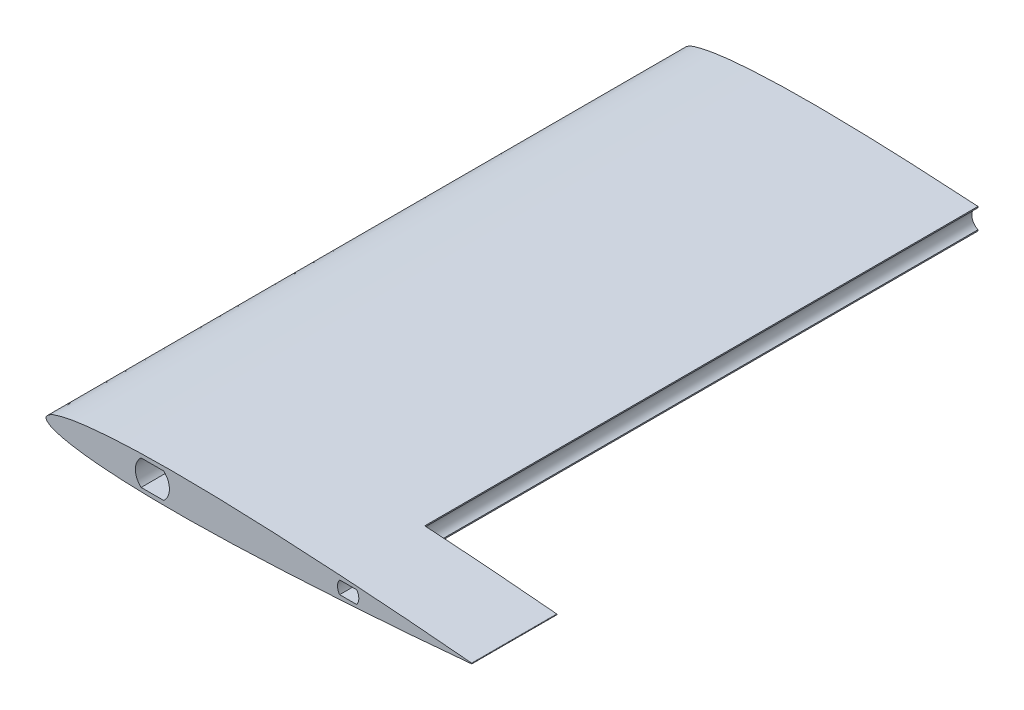
ISO-10303-21;
HEADER;
FILE_DESCRIPTION(('STEP AP214'),'2;1');
FILE_NAME('part.step','',(''),(''),'','','');
FILE_SCHEMA(('AUTOMOTIVE_DESIGN { 1 0 10303 214 1 1 1 1 }'));
ENDSEC;
DATA;
#1=APPLICATION_CONTEXT('core data for automotive mechanical design processes');
#2=APPLICATION_PROTOCOL_DEFINITION('international standard','automotive_design',2000,#1);
#3=PRODUCT_CONTEXT('',#1,'mechanical');
#4=PRODUCT('Part','Part','',(#3));
#5=PRODUCT_RELATED_PRODUCT_CATEGORY('part','',(#4));
#6=PRODUCT_DEFINITION_FORMATION('','',#4);
#7=PRODUCT_DEFINITION_CONTEXT('part definition',#1,'design');
#8=PRODUCT_DEFINITION('design','',#6,#7);
#9=PRODUCT_DEFINITION_SHAPE('','',#8);
#10=(LENGTH_UNIT() NAMED_UNIT(*) SI_UNIT(.MILLI.,.METRE.));
#11=(NAMED_UNIT(*) PLANE_ANGLE_UNIT() SI_UNIT($,.RADIAN.));
#12=(NAMED_UNIT(*) SI_UNIT($,.STERADIAN.) SOLID_ANGLE_UNIT());
#13=UNCERTAINTY_MEASURE_WITH_UNIT(LENGTH_MEASURE(1.E-05),#10,'distance_accuracy_value','');
#14=(GEOMETRIC_REPRESENTATION_CONTEXT(3) GLOBAL_UNCERTAINTY_ASSIGNED_CONTEXT((#13)) GLOBAL_UNIT_ASSIGNED_CONTEXT((#10,
#11,#12)) REPRESENTATION_CONTEXT('',''));
#15=CARTESIAN_POINT('',(0.,0.,0.));
#16=DIRECTION('',(0.,0.,1.));
#17=DIRECTION('',(1.,0.,0.));
#18=AXIS2_PLACEMENT_3D('',#15,#16,#17);
#19=CARTESIAN_POINT('',(0.,0.,150.));
#20=DIRECTION('',(0.,0.,-1.));
#21=DIRECTION('',(-1.,0.,0.));
#22=AXIS2_PLACEMENT_3D('',#19,#20,#21);
#23=PLANE('',#22);
#24=DIRECTION('',(1.,0.,0.));
#25=VECTOR('',#24,1.);
#26=CARTESIAN_POINT('',(73.,-1.5,150.));
#27=LINE('',#26,#25);
#28=CARTESIAN_POINT('',(69.,-1.5,150.));
#29=VERTEX_POINT('',#28);
#30=CARTESIAN_POINT('',(73.,-1.5,150.));
#31=VERTEX_POINT('',#30);
#32=EDGE_CURVE('E151',#29,#31,#27,.T.);
#33=ORIENTED_EDGE('',*,*,#32,.F.);
#34=CARTESIAN_POINT('',(71.,0.,150.));
#35=DIRECTION('',(0.,0.,1.));
#36=DIRECTION('',(1.,0.,0.));
#37=AXIS2_PLACEMENT_3D('',#34,#35,#36);
#38=CIRCLE('',#37,2.49999999999999);
#39=CARTESIAN_POINT('',(69.,1.5,150.));
#40=VERTEX_POINT('',#39);
#41=EDGE_CURVE('E48',#40,#29,#38,.T.);
#42=ORIENTED_EDGE('',*,*,#41,.F.);
#43=DIRECTION('',(-1.,0.,0.));
#44=VECTOR('',#43,1.);
#45=CARTESIAN_POINT('',(69.,1.5,150.));
#46=LINE('',#45,#44);
#47=CARTESIAN_POINT('',(73.,1.5,150.));
#48=VERTEX_POINT('',#47);
#49=EDGE_CURVE('E157',#48,#40,#46,.T.);
#50=ORIENTED_EDGE('',*,*,#49,.F.);
#51=CARTESIAN_POINT('',(71.,0.,150.));
#52=DIRECTION('',(0.,0.,1.));
#53=DIRECTION('',(1.,0.,0.));
#54=AXIS2_PLACEMENT_3D('',#51,#52,#53);
#55=CIRCLE('',#54,2.49999999999999);
#56=EDGE_CURVE('E142',#31,#48,#55,.T.);
#57=ORIENTED_EDGE('',*,*,#56,.F.);
#58=EDGE_LOOP('',(#33,#42,#50,#57));
#59=FACE_BOUND('',#58,.T.);
#60=CARTESIAN_POINT('',(100.,0.084,150.));
#61=CARTESIAN_POINT('',(98.333488814933,0.236746480055364,150.));
#62=CARTESIAN_POINT('',(95.0011947254255,0.542172688557606,150.));
#63=CARTESIAN_POINT('',(88.3355596211879,1.11089898015662,150.));
#64=CARTESIAN_POINT('',(80.0032933562199,1.76361099520967,150.));
#65=CARTESIAN_POINT('',(70.0029989334555,2.45786169254404,150.));
#66=CARTESIAN_POINT('',(60.0031046254057,3.06174772348002,150.));
#67=CARTESIAN_POINT('',(50.0030086005351,3.55213921170033,150.));
#68=CARTESIAN_POINT('',(40.0025985576922,3.90294649372571,150.));
#69=CARTESIAN_POINT('',(31.666961485844,4.02526015065941,150.));
#70=CARTESIAN_POINT('',(24.9991546003269,3.97693379087482,150.));
#71=CARTESIAN_POINT('',(19.9977755867835,3.84497639830756,150.));
#72=CARTESIAN_POINT('',(14.9933631314586,3.59248695861782,150.));
#73=CARTESIAN_POINT('',(10.8271840648808,3.23765157891607,150.));
#74=CARTESIAN_POINT('',(7.48905438800269,2.81402136675529,150.));
#75=CARTESIAN_POINT('',(4.99359465012965,2.40367305928858,150.));
#76=CARTESIAN_POINT('',(2.84962633983361,1.86792549429032,150.));
#77=CARTESIAN_POINT('',(1.16541350274339,1.32098725183071,150.));
#78=CARTESIAN_POINT('',(-0.664613784127027,0.,150.));
#79=CARTESIAN_POINT('',(1.16541350274339,-1.32098725183071,150.));
#80=CARTESIAN_POINT('',(2.84962633983362,-1.86792549429032,150.));
#81=CARTESIAN_POINT('',(4.99359465012963,-2.40367305928857,150.));
#82=CARTESIAN_POINT('',(7.48905438800269,-2.81402136675529,150.));
#83=CARTESIAN_POINT('',(10.8271840648809,-3.23765157891607,150.));
#84=CARTESIAN_POINT('',(14.9933631314586,-3.59248695861782,150.));
#85=CARTESIAN_POINT('',(19.9977755867835,-3.84497639830756,150.));
#86=CARTESIAN_POINT('',(24.9991546003269,-3.97693379087482,150.));
#87=CARTESIAN_POINT('',(31.666961485844,-4.02526015065941,150.));
#88=CARTESIAN_POINT('',(40.0025985576922,-3.90294649372571,150.));
#89=CARTESIAN_POINT('',(50.0030086005351,-3.55213921170033,150.));
#90=CARTESIAN_POINT('',(60.0031046254058,-3.06174772348002,150.));
#91=CARTESIAN_POINT('',(70.0029989334555,-2.45786169254404,150.));
#92=CARTESIAN_POINT('',(80.0032933562199,-1.76361099520967,150.));
#93=CARTESIAN_POINT('',(88.3355596211879,-1.11089898015662,150.));
#94=CARTESIAN_POINT('',(95.0011947254255,-0.542172688557605,150.));
#95=CARTESIAN_POINT('',(98.333488814933,-0.236746480055364,150.));
#96=CARTESIAN_POINT('',(100.,-0.084,150.));
#97=B_SPLINE_CURVE_WITH_KNOTS('',3,(#60,#61,#62,#63,#64,#65,#66,#67,#68,#69,#70,#71,#72,#73,#74,
#75,#76,#77,#78,#79,#80,#81,#82,#83,#84,#85,#86,#87,#88,#89,#90,#91,#92,#93,#94,#95,#96),
.UNSPECIFIED.,.F.,.F.,(4,1,1,1,1,1,1,1,1,1,1,1,1,1,1,1,1,1,1,1,1,1,1,1,1,1,1,1,1,1,1,1,1,1,4),
(0.,0.0248762929189861,0.0497417146704998,0.0994434021110951,0.149112224036195,
0.198750974066913,0.248359097492202,0.297937369716024,0.347491327096237,0.37226694027957,
0.39705092368842,0.421859474838904,0.446731345826762,0.459220451479859,0.471790601601357,
0.484560454432956,0.491195112481227,0.5,0.508804887518773,0.515439545567044,0.528209398398643,
0.540779548520141,0.553268654173238,0.578140525161096,0.60294907631158,0.62773305972043,
0.652508672903763,0.702062630283976,0.751640902507798,0.801249025933086,0.850887775963805,
0.900556597888905,0.9502582853295,0.975123707081014,1.),.UNSPECIFIED.);
#98=CARTESIAN_POINT('',(100.,0.084,150.));
#99=VERTEX_POINT('',#98);
#100=CARTESIAN_POINT('',(100.,-0.084,150.));
#101=VERTEX_POINT('',#100);
#102=EDGE_CURVE('E221',#99,#101,#97,.T.);
#103=ORIENTED_EDGE('',*,*,#102,.T.);
#104=CARTESIAN_POINT('',(100.,0.,150.));
#105=DIRECTION('',(0.,0.,1.));
#106=DIRECTION('',(-1.,0.,0.));
#107=AXIS2_PLACEMENT_3D('',#104,#105,#106);
#108=CIRCLE('',#107,0.084);
#109=EDGE_CURVE('E226',#101,#99,#108,.T.);
#110=ORIENTED_EDGE('',*,*,#109,.T.);
#111=EDGE_LOOP('',(#103,#110));
#112=FACE_BOUND('',#111,.T.);
#113=CARTESIAN_POINT('',(25.,0.,150.));
#114=DIRECTION('',(0.,0.,-1.));
#115=DIRECTION('',(-1.,0.,0.));
#116=AXIS2_PLACEMENT_3D('',#113,#114,#115);
#117=CIRCLE('',#116,4.);
#118=CARTESIAN_POINT('',(27.6457513110646,3.,150.));
#119=VERTEX_POINT('',#118);
#120=CARTESIAN_POINT('',(27.6457513110646,-3.,150.));
#121=VERTEX_POINT('',#120);
#122=EDGE_CURVE('E183',#119,#121,#117,.T.);
#123=ORIENTED_EDGE('',*,*,#122,.T.);
#124=DIRECTION('',(-1.,0.,0.));
#125=VECTOR('',#124,1.);
#126=CARTESIAN_POINT('',(27.6457513110646,-3.,150.));
#127=LINE('',#126,#125);
#128=CARTESIAN_POINT('',(22.3542486889354,-3.,150.));
#129=VERTEX_POINT('',#128);
#130=EDGE_CURVE('E200',#121,#129,#127,.T.);
#131=ORIENTED_EDGE('',*,*,#130,.T.);
#132=CARTESIAN_POINT('',(25.,0.,150.));
#133=DIRECTION('',(0.,0.,-1.));
#134=DIRECTION('',(-1.,0.,0.));
#135=AXIS2_PLACEMENT_3D('',#132,#133,#134);
#136=CIRCLE('',#135,4.);
#137=CARTESIAN_POINT('',(22.3542486889354,3.,150.));
#138=VERTEX_POINT('',#137);
#139=EDGE_CURVE('E203',#129,#138,#136,.T.);
#140=ORIENTED_EDGE('',*,*,#139,.T.);
#141=DIRECTION('',(1.,0.,0.));
#142=VECTOR('',#141,1.);
#143=CARTESIAN_POINT('',(27.6457513110646,3.,150.));
#144=LINE('',#143,#142);
#145=EDGE_CURVE('E188',#138,#119,#144,.T.);
#146=ORIENTED_EDGE('',*,*,#145,.T.);
#147=EDGE_LOOP('',(#123,#131,#140,#146));
#148=FACE_BOUND('',#147,.T.);
#149=ADVANCED_FACE('F32',(#59,#112,#148),#23,.F.);
#150=CARTESIAN_POINT('',(100.,0.084,130.));
#151=CARTESIAN_POINT('',(98.333488814933,0.236746480055364,130.));
#152=CARTESIAN_POINT('',(95.0011947254255,0.542172688557606,130.));
#153=CARTESIAN_POINT('',(88.3355596211879,1.11089898015662,130.));
#154=CARTESIAN_POINT('',(80.0032933562199,1.76361099520967,130.));
#155=CARTESIAN_POINT('',(70.0029989334555,2.45786169254404,130.));
#156=CARTESIAN_POINT('',(60.0031046254057,3.06174772348002,130.));
#157=CARTESIAN_POINT('',(50.0030086005351,3.55213921170033,130.));
#158=CARTESIAN_POINT('',(40.0025985576922,3.90294649372571,130.));
#159=CARTESIAN_POINT('',(31.666961485844,4.02526015065941,130.));
#160=CARTESIAN_POINT('',(24.9991546003269,3.97693379087482,130.));
#161=CARTESIAN_POINT('',(19.9977755867835,3.84497639830756,130.));
#162=CARTESIAN_POINT('',(14.9933631314586,3.59248695861782,130.));
#163=CARTESIAN_POINT('',(10.8271840648808,3.23765157891607,130.));
#164=CARTESIAN_POINT('',(7.48905438800269,2.81402136675529,130.));
#165=CARTESIAN_POINT('',(4.99359465012965,2.40367305928858,130.));
#166=CARTESIAN_POINT('',(2.84962633983361,1.86792549429032,130.));
#167=CARTESIAN_POINT('',(1.16541350274339,1.32098725183071,130.));
#168=CARTESIAN_POINT('',(-0.664613784127027,0.,130.));
#169=CARTESIAN_POINT('',(1.16541350274339,-1.32098725183071,130.));
#170=CARTESIAN_POINT('',(2.84962633983362,-1.86792549429032,130.));
#171=CARTESIAN_POINT('',(4.99359465012963,-2.40367305928857,130.));
#172=CARTESIAN_POINT('',(7.48905438800269,-2.81402136675529,130.));
#173=CARTESIAN_POINT('',(10.8271840648809,-3.23765157891607,130.));
#174=CARTESIAN_POINT('',(14.9933631314586,-3.59248695861782,130.));
#175=CARTESIAN_POINT('',(19.9977755867835,-3.84497639830756,130.));
#176=CARTESIAN_POINT('',(24.9991546003269,-3.97693379087482,130.));
#177=CARTESIAN_POINT('',(31.666961485844,-4.02526015065941,130.));
#178=CARTESIAN_POINT('',(40.0025985576922,-3.90294649372571,130.));
#179=CARTESIAN_POINT('',(50.0030086005351,-3.55213921170033,130.));
#180=CARTESIAN_POINT('',(60.0031046254058,-3.06174772348002,130.));
#181=CARTESIAN_POINT('',(70.0029989334555,-2.45786169254404,130.));
#182=CARTESIAN_POINT('',(80.0032933562199,-1.76361099520967,130.));
#183=CARTESIAN_POINT('',(88.3355596211879,-1.11089898015662,130.));
#184=CARTESIAN_POINT('',(95.0011947254255,-0.542172688557605,130.));
#185=CARTESIAN_POINT('',(98.333488814933,-0.236746480055364,130.));
#186=CARTESIAN_POINT('',(100.,-0.084,130.));
#187=B_SPLINE_CURVE_WITH_KNOTS('',3,(#150,#151,#152,#153,#154,#155,#156,#157,#158,#159,#160,
#161,#162,#163,#164,#165,#166,#167,#168,#169,#170,#171,#172,#173,#174,#175,#176,#177,#178,#179,
#180,#181,#182,#183,#184,#185,#186),.UNSPECIFIED.,.F.,.F.,(4,1,1,1,1,1,1,1,1,1,1,1,1,1,1,1,1,1,
1,1,1,1,1,1,1,1,1,1,1,1,1,1,1,1,4),(0.,0.0248762929189861,0.0497417146704998,0.0994434021110951,
0.149112224036195,0.198750974066913,0.248359097492202,0.297937369716024,0.347491327096237,
0.37226694027957,0.39705092368842,0.421859474838904,0.446731345826762,0.459220451479859,
0.471790601601357,0.484560454432956,0.491195112481227,0.5,0.508804887518773,0.515439545567044,
0.528209398398643,0.540779548520141,0.553268654173238,0.578140525161096,0.60294907631158,
0.62773305972043,0.652508672903763,0.702062630283976,0.751640902507798,0.801249025933086,
0.850887775963805,0.900556597888905,0.9502582853295,0.975123707081014,1.),.UNSPECIFIED.);
#188=DIRECTION('',(0.,0.,-1.));
#189=VECTOR('',#188,1.);
#190=SURFACE_OF_LINEAR_EXTRUSION('',#187,#189);
#191=CARTESIAN_POINT('',(100.,0.084,0.));
#192=CARTESIAN_POINT('',(98.333488814933,0.236746480055364,0.));
#193=CARTESIAN_POINT('',(95.0011947254255,0.542172688557606,0.));
#194=CARTESIAN_POINT('',(88.3355596211879,1.11089898015662,0.));
#195=CARTESIAN_POINT('',(80.0032933562199,1.76361099520967,0.));
#196=CARTESIAN_POINT('',(70.0029989334555,2.45786169254404,0.));
#197=CARTESIAN_POINT('',(60.0031046254057,3.06174772348002,0.));
#198=CARTESIAN_POINT('',(50.0030086005351,3.55213921170033,0.));
#199=CARTESIAN_POINT('',(40.0025985576922,3.90294649372571,0.));
#200=CARTESIAN_POINT('',(31.666961485844,4.02526015065941,0.));
#201=CARTESIAN_POINT('',(24.9991546003269,3.97693379087482,0.));
#202=CARTESIAN_POINT('',(19.9977755867835,3.84497639830756,0.));
#203=CARTESIAN_POINT('',(14.9933631314586,3.59248695861782,0.));
#204=CARTESIAN_POINT('',(10.8271840648808,3.23765157891607,0.));
#205=CARTESIAN_POINT('',(7.48905438800269,2.81402136675529,0.));
#206=CARTESIAN_POINT('',(4.99359465012965,2.40367305928858,0.));
#207=CARTESIAN_POINT('',(2.84962633983361,1.86792549429032,0.));
#208=CARTESIAN_POINT('',(1.16541350274339,1.32098725183071,0.));
#209=CARTESIAN_POINT('',(-0.664613784127027,0.,0.));
#210=CARTESIAN_POINT('',(1.16541350274339,-1.32098725183071,0.));
#211=CARTESIAN_POINT('',(2.84962633983362,-1.86792549429032,0.));
#212=CARTESIAN_POINT('',(4.99359465012963,-2.40367305928857,0.));
#213=CARTESIAN_POINT('',(7.48905438800269,-2.81402136675529,0.));
#214=CARTESIAN_POINT('',(10.8271840648809,-3.23765157891607,0.));
#215=CARTESIAN_POINT('',(14.9933631314586,-3.59248695861782,0.));
#216=CARTESIAN_POINT('',(19.9977755867835,-3.84497639830756,0.));
#217=CARTESIAN_POINT('',(24.9991546003269,-3.97693379087482,0.));
#218=CARTESIAN_POINT('',(31.666961485844,-4.02526015065941,0.));
#219=CARTESIAN_POINT('',(40.0025985576922,-3.90294649372571,0.));
#220=CARTESIAN_POINT('',(50.0030086005351,-3.55213921170033,0.));
#221=CARTESIAN_POINT('',(60.0031046254058,-3.06174772348002,0.));
#222=CARTESIAN_POINT('',(70.0029989334555,-2.45786169254404,0.));
#223=CARTESIAN_POINT('',(80.0032933562199,-1.76361099520967,0.));
#224=CARTESIAN_POINT('',(88.3355596211879,-1.11089898015662,0.));
#225=CARTESIAN_POINT('',(95.0011947254255,-0.542172688557605,0.));
#226=CARTESIAN_POINT('',(98.333488814933,-0.236746480055364,0.));
#227=CARTESIAN_POINT('',(100.,-0.084,0.));
#228=B_SPLINE_CURVE_WITH_KNOTS('',3,(#191,#192,#193,#194,#195,#196,#197,#198,#199,#200,#201,
#202,#203,#204,#205,#206,#207,#208,#209,#210,#211,#212,#213,#214,#215,#216,#217,#218,#219,#220,
#221,#222,#223,#224,#225,#226,#227),.UNSPECIFIED.,.F.,.F.,(4,1,1,1,1,1,1,1,1,1,1,1,1,1,1,1,1,1,
1,1,1,1,1,1,1,1,1,1,1,1,1,1,1,1,4),(0.,0.0248762929189861,0.0497417146704998,0.0994434021110951,
0.149112224036195,0.198750974066913,0.248359097492202,0.297937369716024,0.347491327096237,
0.37226694027957,0.39705092368842,0.421859474838904,0.446731345826762,0.459220451479859,
0.471790601601357,0.484560454432956,0.491195112481227,0.5,0.508804887518773,0.515439545567044,
0.528209398398643,0.540779548520141,0.553268654173238,0.578140525161096,0.60294907631158,
0.62773305972043,0.652508672903763,0.702062630283976,0.751640902507798,0.801249025933086,
0.850887775963805,0.900556597888905,0.9502582853295,0.975123707081014,1.),.UNSPECIFIED.);
#229=CARTESIAN_POINT('',(68.9999999999599,2.50744788018033,0.));
#230=VERTEX_POINT('',#229);
#231=CARTESIAN_POINT('',(68.9999999766901,-2.50744788166933,0.));
#232=VERTEX_POINT('',#231);
#233=EDGE_CURVE('E245',#230,#232,#228,.T.);
#234=ORIENTED_EDGE('',*,*,#233,.T.);
#235=DIRECTION('',(0.,0.,-1.));
#236=VECTOR('',#235,1.);
#237=CARTESIAN_POINT('',(68.9999999999599,-2.50744788017844,135.843729929357));
#238=LINE('',#237,#236);
#239=CARTESIAN_POINT('',(68.9999999999599,-2.50744788017844,130.));
#240=VERTEX_POINT('',#239);
#241=EDGE_CURVE('E173',#240,#232,#238,.T.);
#242=ORIENTED_EDGE('',*,*,#241,.F.);
#243=CARTESIAN_POINT('',(100.,0.084,130.));
#244=CARTESIAN_POINT('',(98.333488814933,0.236746480055364,130.));
#245=CARTESIAN_POINT('',(95.0011947254255,0.542172688557606,130.));
#246=CARTESIAN_POINT('',(88.3355596211879,1.11089898015662,130.));
#247=CARTESIAN_POINT('',(80.0032933562199,1.76361099520967,130.));
#248=CARTESIAN_POINT('',(70.0029989334555,2.45786169254404,130.));
#249=CARTESIAN_POINT('',(60.0031046254057,3.06174772348002,130.));
#250=CARTESIAN_POINT('',(50.0030086005351,3.55213921170033,130.));
#251=CARTESIAN_POINT('',(40.0025985576922,3.90294649372571,130.));
#252=CARTESIAN_POINT('',(31.666961485844,4.02526015065941,130.));
#253=CARTESIAN_POINT('',(24.9991546003269,3.97693379087482,130.));
#254=CARTESIAN_POINT('',(19.9977755867835,3.84497639830756,130.));
#255=CARTESIAN_POINT('',(14.9933631314586,3.59248695861782,130.));
#256=CARTESIAN_POINT('',(10.8271840648808,3.23765157891607,130.));
#257=CARTESIAN_POINT('',(7.48905438800269,2.81402136675529,130.));
#258=CARTESIAN_POINT('',(4.99359465012965,2.40367305928858,130.));
#259=CARTESIAN_POINT('',(2.84962633983361,1.86792549429032,130.));
#260=CARTESIAN_POINT('',(1.16541350274339,1.32098725183071,130.));
#261=CARTESIAN_POINT('',(-0.664613784127027,0.,130.));
#262=CARTESIAN_POINT('',(1.16541350274339,-1.32098725183071,130.));
#263=CARTESIAN_POINT('',(2.84962633983362,-1.86792549429032,130.));
#264=CARTESIAN_POINT('',(4.99359465012963,-2.40367305928857,130.));
#265=CARTESIAN_POINT('',(7.48905438800269,-2.81402136675529,130.));
#266=CARTESIAN_POINT('',(10.8271840648809,-3.23765157891607,130.));
#267=CARTESIAN_POINT('',(14.9933631314586,-3.59248695861782,130.));
#268=CARTESIAN_POINT('',(19.9977755867835,-3.84497639830756,130.));
#269=CARTESIAN_POINT('',(24.9991546003269,-3.97693379087482,130.));
#270=CARTESIAN_POINT('',(31.666961485844,-4.02526015065941,130.));
#271=CARTESIAN_POINT('',(40.0025985576922,-3.90294649372571,130.));
#272=CARTESIAN_POINT('',(50.0030086005351,-3.55213921170033,130.));
#273=CARTESIAN_POINT('',(60.0031046254058,-3.06174772348002,130.));
#274=CARTESIAN_POINT('',(70.0029989334555,-2.45786169254404,130.));
#275=CARTESIAN_POINT('',(80.0032933562199,-1.76361099520967,130.));
#276=CARTESIAN_POINT('',(88.3355596211879,-1.11089898015662,130.));
#277=CARTESIAN_POINT('',(95.0011947254255,-0.542172688557605,130.));
#278=CARTESIAN_POINT('',(98.333488814933,-0.236746480055364,130.));
#279=CARTESIAN_POINT('',(100.,-0.084,130.));
#280=B_SPLINE_CURVE_WITH_KNOTS('',3,(#243,#244,#245,#246,#247,#248,#249,#250,#251,#252,#253,
#254,#255,#256,#257,#258,#259,#260,#261,#262,#263,#264,#265,#266,#267,#268,#269,#270,#271,#272,
#273,#274,#275,#276,#277,#278,#279),.UNSPECIFIED.,.F.,.F.,(4,1,1,1,1,1,1,1,1,1,1,1,1,1,1,1,1,1,
1,1,1,1,1,1,1,1,1,1,1,1,1,1,1,1,4),(0.,0.0248762929189861,0.0497417146704998,0.0994434021110951,
0.149112224036195,0.198750974066913,0.248359097492202,0.297937369716024,0.347491327096237,
0.37226694027957,0.39705092368842,0.421859474838904,0.446731345826762,0.459220451479859,
0.471790601601357,0.484560454432956,0.491195112481227,0.5,0.508804887518773,0.515439545567044,
0.528209398398643,0.540779548520141,0.553268654173238,0.578140525161096,0.60294907631158,
0.62773305972043,0.652508672903763,0.702062630283976,0.751640902507798,0.801249025933086,
0.850887775963805,0.900556597888905,0.9502582853295,0.975123707081014,1.),.UNSPECIFIED.);
#281=CARTESIAN_POINT('',(100.,-0.084,130.));
#282=VERTEX_POINT('',#281);
#283=EDGE_CURVE('E220',#240,#282,#280,.T.);
#284=ORIENTED_EDGE('',*,*,#283,.T.);
#285=DIRECTION('',(0.,0.,-1.));
#286=VECTOR('',#285,1.);
#287=CARTESIAN_POINT('',(100.,-0.084,150.));
#288=LINE('',#287,#286);
#289=EDGE_CURVE('E243',#101,#282,#288,.T.);
#290=ORIENTED_EDGE('',*,*,#289,.F.);
#291=ORIENTED_EDGE('',*,*,#102,.F.);
#292=DIRECTION('',(0.,0.,-1.));
#293=VECTOR('',#292,1.);
#294=CARTESIAN_POINT('',(100.,0.084,150.));
#295=LINE('',#294,#293);
#296=CARTESIAN_POINT('',(100.,0.084,130.));
#297=VERTEX_POINT('',#296);
#298=EDGE_CURVE('E232',#99,#297,#295,.T.);
#299=ORIENTED_EDGE('',*,*,#298,.T.);
#300=CARTESIAN_POINT('',(68.9999999999599,2.50744788018033,130.));
#301=VERTEX_POINT('',#300);
#302=EDGE_CURVE('E233',#297,#301,#280,.T.);
#303=ORIENTED_EDGE('',*,*,#302,.T.);
#304=DIRECTION('',(0.,0.,-1.));
#305=VECTOR('',#304,1.);
#306=CARTESIAN_POINT('',(68.9999999999599,2.50744788018033,135.843729929357));
#307=LINE('',#306,#305);
#308=EDGE_CURVE('E174',#301,#230,#307,.T.);
#309=ORIENTED_EDGE('',*,*,#308,.T.);
#310=EDGE_LOOP('',(#234,#242,#284,#290,#291,#299,#303,#309));
#311=FACE_BOUND('',#310,.T.);
#312=ADVANCED_FACE('F34',(#311),#190,.F.);
#313=CARTESIAN_POINT('',(69.9999999999599,9.44990613538366E-13,130.));
#314=DIRECTION('',(0.,0.,-1.));
#315=DIRECTION('',(-1.,0.,0.));
#316=AXIS2_PLACEMENT_3D('',#313,#314,#315);
#317=CYLINDRICAL_SURFACE('',#316,2.44300000000355);
#318=CARTESIAN_POINT('',(69.9999999999599,9.44990613538366E-13,0.));
#319=DIRECTION('',(0.,0.,-1.));
#320=DIRECTION('',(-1.,0.,0.));
#321=AXIS2_PLACEMENT_3D('',#318,#319,#320);
#322=CIRCLE('',#321,2.44300000000355);
#323=CARTESIAN_POINT('',(68.9999999999599,-2.2289569309462,0.));
#324=VERTEX_POINT('',#323);
#325=CARTESIAN_POINT('',(68.9999999999599,2.22895693094809,0.));
#326=VERTEX_POINT('',#325);
#327=EDGE_CURVE('E257',#324,#326,#322,.T.);
#328=ORIENTED_EDGE('',*,*,#327,.T.);
#329=DIRECTION('',(0.,0.,-1.));
#330=VECTOR('',#329,1.);
#331=CARTESIAN_POINT('',(68.9999999999599,2.22895693094809,130.));
#332=LINE('',#331,#330);
#333=CARTESIAN_POINT('',(68.9999999999599,2.22895693094809,130.));
#334=VERTEX_POINT('',#333);
#335=EDGE_CURVE('E180',#326,#334,#332,.F.);
#336=ORIENTED_EDGE('',*,*,#335,.T.);
#337=CARTESIAN_POINT('',(69.9999999999599,9.44990613538366E-13,130.));
#338=DIRECTION('',(0.,0.,-1.));
#339=DIRECTION('',(-1.,0.,0.));
#340=AXIS2_PLACEMENT_3D('',#337,#338,#339);
#341=CIRCLE('',#340,2.44300000000355);
#342=CARTESIAN_POINT('',(68.9999999999599,-2.2289569309462,130.));
#343=VERTEX_POINT('',#342);
#344=EDGE_CURVE('E250',#343,#334,#341,.T.);
#345=ORIENTED_EDGE('',*,*,#344,.F.);
#346=DIRECTION('',(0.,0.,-1.));
#347=VECTOR('',#346,1.);
#348=CARTESIAN_POINT('',(68.9999999999599,-2.2289569309462,130.));
#349=LINE('',#348,#347);
#350=EDGE_CURVE('E169',#343,#324,#349,.T.);
#351=ORIENTED_EDGE('',*,*,#350,.T.);
#352=EDGE_LOOP('',(#328,#336,#345,#351));
#353=FACE_BOUND('',#352,.T.);
#354=ADVANCED_FACE('F298',(#353),#317,.F.);
#355=CARTESIAN_POINT('',(0.,0.,0.));
#356=DIRECTION('',(0.,0.,-1.));
#357=DIRECTION('',(-1.,0.,0.));
#358=AXIS2_PLACEMENT_3D('',#355,#356,#357);
#359=PLANE('',#358);
#360=DIRECTION('',(0.,1.,0.));
#361=VECTOR('',#360,1.);
#362=CARTESIAN_POINT('',(68.9999999999599,2.50744788018033,0.));
#363=LINE('',#362,#361);
#364=EDGE_CURVE('E171',#232,#324,#363,.T.);
#365=ORIENTED_EDGE('',*,*,#364,.F.);
#366=ORIENTED_EDGE('',*,*,#233,.F.);
#367=EDGE_CURVE('E164',#326,#230,#363,.T.);
#368=ORIENTED_EDGE('',*,*,#367,.F.);
#369=ORIENTED_EDGE('',*,*,#327,.F.);
#370=EDGE_LOOP('',(#365,#366,#368,#369));
#371=FACE_BOUND('',#370,.T.);
#372=CARTESIAN_POINT('',(25.,0.,0.));
#373=DIRECTION('',(0.,0.,1.));
#374=DIRECTION('',(1.,0.,0.));
#375=AXIS2_PLACEMENT_3D('',#372,#373,#374);
#376=CIRCLE('',#375,3.);
#377=CARTESIAN_POINT('',(28.,0.,0.));
#378=VERTEX_POINT('',#377);
#379=EDGE_CURVE('E217',#378,#378,#376,.T.);
#380=ORIENTED_EDGE('',*,*,#379,.T.);
#381=EDGE_LOOP('',(#380));
#382=FACE_BOUND('',#381,.T.);
#383=ADVANCED_FACE('F307',(#371,#382),#359,.T.);
#384=CARTESIAN_POINT('',(0.,0.,130.));
#385=DIRECTION('',(0.,0.,-1.));
#386=DIRECTION('',(-1.,0.,0.));
#387=AXIS2_PLACEMENT_3D('',#384,#385,#386);
#388=PLANE('',#387);
#389=CARTESIAN_POINT('',(71.,0.,130.));
#390=DIRECTION('',(0.,0.,-1.));
#391=DIRECTION('',(-1.,0.,0.));
#392=AXIS2_PLACEMENT_3D('',#389,#390,#391);
#393=CIRCLE('',#392,2.49999999999999);
#394=CARTESIAN_POINT('',(69.,-1.5,130.));
#395=VERTEX_POINT('',#394);
#396=CARTESIAN_POINT('',(69.,1.5,130.));
#397=VERTEX_POINT('',#396);
#398=EDGE_CURVE('E11',#395,#397,#393,.T.);
#399=ORIENTED_EDGE('',*,*,#398,.F.);
#400=DIRECTION('',(-1.,0.,0.));
#401=VECTOR('',#400,1.);
#402=CARTESIAN_POINT('',(0.,-1.5,130.));
#403=LINE('',#402,#401);
#404=CARTESIAN_POINT('',(73.,-1.5,130.));
#405=VERTEX_POINT('',#404);
#406=EDGE_CURVE('E270',#405,#395,#403,.T.);
#407=ORIENTED_EDGE('',*,*,#406,.F.);
#408=CARTESIAN_POINT('',(71.,0.,130.));
#409=DIRECTION('',(0.,0.,-1.));
#410=DIRECTION('',(-1.,0.,0.));
#411=AXIS2_PLACEMENT_3D('',#408,#409,#410);
#412=CIRCLE('',#411,2.49999999999999);
#413=CARTESIAN_POINT('',(73.,1.5,130.));
#414=VERTEX_POINT('',#413);
#415=EDGE_CURVE('E145',#414,#405,#412,.T.);
#416=ORIENTED_EDGE('',*,*,#415,.F.);
#417=DIRECTION('',(1.,0.,0.));
#418=VECTOR('',#417,1.);
#419=CARTESIAN_POINT('',(0.,1.5,130.));
#420=LINE('',#419,#418);
#421=EDGE_CURVE('E41',#397,#414,#420,.T.);
#422=ORIENTED_EDGE('',*,*,#421,.F.);
#423=EDGE_LOOP('',(#399,#407,#416,#422));
#424=FACE_BOUND('',#423,.T.);
#425=ORIENTED_EDGE('',*,*,#344,.T.);
#426=DIRECTION('',(0.,-1.,0.));
#427=VECTOR('',#426,1.);
#428=CARTESIAN_POINT('',(68.9999999999599,2.50744788018033,130.));
#429=LINE('',#428,#427);
#430=EDGE_CURVE('E167',#301,#334,#429,.T.);
#431=ORIENTED_EDGE('',*,*,#430,.F.);
#432=ORIENTED_EDGE('',*,*,#302,.F.);
#433=CARTESIAN_POINT('',(100.,0.,130.));
#434=DIRECTION('',(0.,0.,1.));
#435=DIRECTION('',(-1.,0.,0.));
#436=AXIS2_PLACEMENT_3D('',#433,#434,#435);
#437=CIRCLE('',#436,0.084);
#438=EDGE_CURVE('E227',#282,#297,#437,.T.);
#439=ORIENTED_EDGE('',*,*,#438,.F.);
#440=ORIENTED_EDGE('',*,*,#283,.F.);
#441=EDGE_CURVE('E170',#343,#240,#429,.T.);
#442=ORIENTED_EDGE('',*,*,#441,.F.);
#443=EDGE_LOOP('',(#425,#431,#432,#439,#440,#442));
#444=FACE_BOUND('',#443,.T.);
#445=ADVANCED_FACE('F278',(#424,#444),#388,.T.);
#446=CARTESIAN_POINT('',(100.,0.,150.));
#447=DIRECTION('',(0.,0.,-1.));
#448=DIRECTION('',(-1.,0.,0.));
#449=AXIS2_PLACEMENT_3D('',#446,#447,#448);
#450=CYLINDRICAL_SURFACE('',#449,0.084);
#451=ORIENTED_EDGE('',*,*,#438,.T.);
#452=ORIENTED_EDGE('',*,*,#298,.F.);
#453=ORIENTED_EDGE('',*,*,#109,.F.);
#454=ORIENTED_EDGE('',*,*,#289,.T.);
#455=EDGE_LOOP('',(#451,#452,#453,#454));
#456=FACE_BOUND('',#455,.T.);
#457=ADVANCED_FACE('F306',(#456),#450,.T.);
#458=CARTESIAN_POINT('',(25.,0.,0.));
#459=DIRECTION('',(0.,0.,1.));
#460=DIRECTION('',(1.,0.,0.));
#461=AXIS2_PLACEMENT_3D('',#458,#459,#460);
#462=CYLINDRICAL_SURFACE('',#461,3.);
#463=CARTESIAN_POINT('',(25.,0.,135.));
#464=DIRECTION('',(0.,0.,-1.));
#465=DIRECTION('',(-1.,0.,0.));
#466=AXIS2_PLACEMENT_3D('',#463,#464,#465);
#467=CIRCLE('',#466,3.);
#468=CARTESIAN_POINT('',(25.,3.,135.));
#469=VERTEX_POINT('',#468);
#470=CARTESIAN_POINT('',(25.,-3.,135.));
#471=VERTEX_POINT('',#470);
#472=EDGE_CURVE('E256',#469,#471,#467,.F.);
#473=ORIENTED_EDGE('',*,*,#472,.T.);
#474=EDGE_CURVE('E269',#471,#469,#467,.F.);
#475=ORIENTED_EDGE('',*,*,#474,.T.);
#476=EDGE_LOOP('',(#473,#475));
#477=FACE_BOUND('',#476,.T.);
#478=ORIENTED_EDGE('',*,*,#379,.F.);
#479=EDGE_LOOP('',(#478));
#480=FACE_BOUND('',#479,.T.);
#481=ADVANCED_FACE('F302',(#477,#480),#462,.F.);
#482=CARTESIAN_POINT('',(27.6457513110646,-3.,135.));
#483=DIRECTION('',(0.,1.,0.));
#484=DIRECTION('',(0.,0.,1.));
#485=AXIS2_PLACEMENT_3D('',#482,#483,#484);
#486=PLANE('',#485);
#487=ORIENTED_EDGE('',*,*,#130,.F.);
#488=DIRECTION('',(0.,0.,1.));
#489=VECTOR('',#488,1.);
#490=CARTESIAN_POINT('',(27.6457513110646,-3.,135.));
#491=LINE('',#490,#489);
#492=CARTESIAN_POINT('',(27.6457513110646,-3.,135.));
#493=VERTEX_POINT('',#492);
#494=EDGE_CURVE('E214',#493,#121,#491,.T.);
#495=ORIENTED_EDGE('',*,*,#494,.F.);
#496=DIRECTION('',(-1.,0.,0.));
#497=VECTOR('',#496,1.);
#498=CARTESIAN_POINT('',(27.6457513110646,-3.,135.));
#499=LINE('',#498,#497);
#500=EDGE_CURVE('E189',#493,#471,#499,.T.);
#501=ORIENTED_EDGE('',*,*,#500,.T.);
#502=CARTESIAN_POINT('',(22.3542486889354,-3.,135.));
#503=VERTEX_POINT('',#502);
#504=EDGE_CURVE('E187',#471,#503,#499,.T.);
#505=ORIENTED_EDGE('',*,*,#504,.T.);
#506=DIRECTION('',(0.,0.,1.));
#507=VECTOR('',#506,1.);
#508=CARTESIAN_POINT('',(22.3542486889354,-3.,135.));
#509=LINE('',#508,#507);
#510=EDGE_CURVE('E212',#503,#129,#509,.T.);
#511=ORIENTED_EDGE('',*,*,#510,.T.);
#512=EDGE_LOOP('',(#487,#495,#501,#505,#511));
#513=FACE_BOUND('',#512,.T.);
#514=ADVANCED_FACE('F342',(#513),#486,.T.);
#515=CARTESIAN_POINT('',(27.6457513110646,3.,135.));
#516=DIRECTION('',(0.,-1.,0.));
#517=DIRECTION('',(0.,0.,-1.));
#518=AXIS2_PLACEMENT_3D('',#515,#516,#517);
#519=PLANE('',#518);
#520=ORIENTED_EDGE('',*,*,#145,.F.);
#521=DIRECTION('',(0.,0.,1.));
#522=VECTOR('',#521,1.);
#523=CARTESIAN_POINT('',(22.3542486889354,3.,135.));
#524=LINE('',#523,#522);
#525=CARTESIAN_POINT('',(22.3542486889354,3.,135.));
#526=VERTEX_POINT('',#525);
#527=EDGE_CURVE('E209',#526,#138,#524,.T.);
#528=ORIENTED_EDGE('',*,*,#527,.F.);
#529=DIRECTION('',(1.,0.,0.));
#530=VECTOR('',#529,1.);
#531=CARTESIAN_POINT('',(27.6457513110646,3.,135.));
#532=LINE('',#531,#530);
#533=EDGE_CURVE('E194',#526,#469,#532,.T.);
#534=ORIENTED_EDGE('',*,*,#533,.T.);
#535=CARTESIAN_POINT('',(27.6457513110646,3.,135.));
#536=VERTEX_POINT('',#535);
#537=EDGE_CURVE('E193',#469,#536,#532,.T.);
#538=ORIENTED_EDGE('',*,*,#537,.T.);
#539=DIRECTION('',(0.,0.,1.));
#540=VECTOR('',#539,1.);
#541=CARTESIAN_POINT('',(27.6457513110646,3.,135.));
#542=LINE('',#541,#540);
#543=EDGE_CURVE('E197',#536,#119,#542,.T.);
#544=ORIENTED_EDGE('',*,*,#543,.T.);
#545=EDGE_LOOP('',(#520,#528,#534,#538,#544));
#546=FACE_BOUND('',#545,.T.);
#547=ADVANCED_FACE('F352',(#546),#519,.T.);
#548=CARTESIAN_POINT('',(25.,0.,135.));
#549=DIRECTION('',(0.,0.,-1.));
#550=DIRECTION('',(-1.,0.,0.));
#551=AXIS2_PLACEMENT_3D('',#548,#549,#550);
#552=PLANE('',#551);
#553=ORIENTED_EDGE('',*,*,#500,.F.);
#554=CARTESIAN_POINT('',(25.,0.,135.));
#555=DIRECTION('',(0.,0.,-1.));
#556=DIRECTION('',(-1.,0.,0.));
#557=AXIS2_PLACEMENT_3D('',#554,#555,#556);
#558=CIRCLE('',#557,4.);
#559=EDGE_CURVE('E184',#536,#493,#558,.T.);
#560=ORIENTED_EDGE('',*,*,#559,.F.);
#561=ORIENTED_EDGE('',*,*,#537,.F.);
#562=ORIENTED_EDGE('',*,*,#474,.F.);
#563=EDGE_LOOP('',(#553,#560,#561,#562));
#564=FACE_BOUND('',#563,.T.);
#565=ADVANCED_FACE('F360',(#564),#552,.F.);
#566=ORIENTED_EDGE('',*,*,#533,.F.);
#567=CARTESIAN_POINT('',(25.,0.,135.));
#568=DIRECTION('',(0.,0.,-1.));
#569=DIRECTION('',(-1.,0.,0.));
#570=AXIS2_PLACEMENT_3D('',#567,#568,#569);
#571=CIRCLE('',#570,4.);
#572=EDGE_CURVE('E191',#503,#526,#571,.T.);
#573=ORIENTED_EDGE('',*,*,#572,.F.);
#574=ORIENTED_EDGE('',*,*,#504,.F.);
#575=ORIENTED_EDGE('',*,*,#472,.F.);
#576=EDGE_LOOP('',(#566,#573,#574,#575));
#577=FACE_BOUND('',#576,.T.);
#578=ADVANCED_FACE('F355',(#577),#552,.F.);
#579=CARTESIAN_POINT('',(25.,0.,135.));
#580=DIRECTION('',(0.,0.,1.));
#581=DIRECTION('',(1.,0.,0.));
#582=AXIS2_PLACEMENT_3D('',#579,#580,#581);
#583=CYLINDRICAL_SURFACE('',#582,4.);
#584=ORIENTED_EDGE('',*,*,#122,.F.);
#585=ORIENTED_EDGE('',*,*,#543,.F.);
#586=ORIENTED_EDGE('',*,*,#559,.T.);
#587=ORIENTED_EDGE('',*,*,#494,.T.);
#588=EDGE_LOOP('',(#584,#585,#586,#587));
#589=FACE_BOUND('',#588,.T.);
#590=ADVANCED_FACE('F338',(#589),#583,.F.);
#591=CARTESIAN_POINT('',(25.,0.,135.));
#592=DIRECTION('',(0.,0.,1.));
#593=DIRECTION('',(1.,0.,0.));
#594=AXIS2_PLACEMENT_3D('',#591,#592,#593);
#595=CYLINDRICAL_SURFACE('',#594,4.);
#596=ORIENTED_EDGE('',*,*,#139,.F.);
#597=ORIENTED_EDGE('',*,*,#510,.F.);
#598=ORIENTED_EDGE('',*,*,#572,.T.);
#599=ORIENTED_EDGE('',*,*,#527,.T.);
#600=EDGE_LOOP('',(#596,#597,#598,#599));
#601=FACE_BOUND('',#600,.T.);
#602=ADVANCED_FACE('F348',(#601),#595,.F.);
#603=CARTESIAN_POINT('',(68.9999999999599,2.50744788018033,135.843729929357));
#604=DIRECTION('',(-1.,0.,0.));
#605=DIRECTION('',(0.,0.,1.));
#606=AXIS2_PLACEMENT_3D('',#603,#604,#605);
#607=PLANE('',#606);
#608=ORIENTED_EDGE('',*,*,#367,.T.);
#609=ORIENTED_EDGE('',*,*,#308,.F.);
#610=ORIENTED_EDGE('',*,*,#430,.T.);
#611=ORIENTED_EDGE('',*,*,#335,.F.);
#612=EDGE_LOOP('',(#608,#609,#610,#611));
#613=FACE_BOUND('',#612,.T.);
#614=ADVANCED_FACE('F289',(#613),#607,.F.);
#615=ORIENTED_EDGE('',*,*,#441,.T.);
#616=ORIENTED_EDGE('',*,*,#241,.T.);
#617=ORIENTED_EDGE('',*,*,#364,.T.);
#618=ORIENTED_EDGE('',*,*,#350,.F.);
#619=EDGE_LOOP('',(#615,#616,#617,#618));
#620=FACE_BOUND('',#619,.T.);
#621=ADVANCED_FACE('F282',(#620),#607,.F.);
#622=CARTESIAN_POINT('',(71.,0.,0.));
#623=DIRECTION('',(0.,0.,1.));
#624=DIRECTION('',(1.,0.,0.));
#625=AXIS2_PLACEMENT_3D('',#622,#623,#624);
#626=CYLINDRICAL_SURFACE('',#625,2.49999999999999);
#627=ORIENTED_EDGE('',*,*,#398,.T.);
#628=DIRECTION('',(0.,0.,1.));
#629=VECTOR('',#628,1.);
#630=CARTESIAN_POINT('',(69.,1.5,0.));
#631=LINE('',#630,#629);
#632=EDGE_CURVE('E162',#397,#40,#631,.T.);
#633=ORIENTED_EDGE('',*,*,#632,.T.);
#634=ORIENTED_EDGE('',*,*,#41,.T.);
#635=DIRECTION('',(0.,0.,1.));
#636=VECTOR('',#635,1.);
#637=CARTESIAN_POINT('',(69.,-1.5,0.));
#638=LINE('',#637,#636);
#639=EDGE_CURVE('E148',#395,#29,#638,.T.);
#640=ORIENTED_EDGE('',*,*,#639,.F.);
#641=EDGE_LOOP('',(#627,#633,#634,#640));
#642=FACE_BOUND('',#641,.T.);
#643=ADVANCED_FACE('F280',(#642),#626,.F.);
#644=CARTESIAN_POINT('',(69.,1.5,0.));
#645=DIRECTION('',(0.,1.,0.));
#646=DIRECTION('',(0.,0.,1.));
#647=AXIS2_PLACEMENT_3D('',#644,#645,#646);
#648=PLANE('',#647);
#649=ORIENTED_EDGE('',*,*,#421,.T.);
#650=DIRECTION('',(0.,0.,1.));
#651=VECTOR('',#650,1.);
#652=CARTESIAN_POINT('',(73.,1.5,0.));
#653=LINE('',#652,#651);
#654=EDGE_CURVE('E147',#414,#48,#653,.T.);
#655=ORIENTED_EDGE('',*,*,#654,.T.);
#656=ORIENTED_EDGE('',*,*,#49,.T.);
#657=ORIENTED_EDGE('',*,*,#632,.F.);
#658=EDGE_LOOP('',(#649,#655,#656,#657));
#659=FACE_BOUND('',#658,.T.);
#660=ADVANCED_FACE('F275',(#659),#648,.F.);
#661=CARTESIAN_POINT('',(71.,0.,0.));
#662=DIRECTION('',(0.,0.,1.));
#663=DIRECTION('',(1.,0.,0.));
#664=AXIS2_PLACEMENT_3D('',#661,#662,#663);
#665=CYLINDRICAL_SURFACE('',#664,2.49999999999999);
#666=ORIENTED_EDGE('',*,*,#415,.T.);
#667=DIRECTION('',(0.,0.,1.));
#668=VECTOR('',#667,1.);
#669=CARTESIAN_POINT('',(73.,-1.5,0.));
#670=LINE('',#669,#668);
#671=EDGE_CURVE('E56',#405,#31,#670,.T.);
#672=ORIENTED_EDGE('',*,*,#671,.T.);
#673=ORIENTED_EDGE('',*,*,#56,.T.);
#674=ORIENTED_EDGE('',*,*,#654,.F.);
#675=EDGE_LOOP('',(#666,#672,#673,#674));
#676=FACE_BOUND('',#675,.T.);
#677=ADVANCED_FACE('F139',(#676),#665,.F.);
#678=CARTESIAN_POINT('',(73.,-1.5,0.));
#679=DIRECTION('',(0.,-1.,0.));
#680=DIRECTION('',(0.,0.,-1.));
#681=AXIS2_PLACEMENT_3D('',#678,#679,#680);
#682=PLANE('',#681);
#683=ORIENTED_EDGE('',*,*,#406,.T.);
#684=ORIENTED_EDGE('',*,*,#639,.T.);
#685=ORIENTED_EDGE('',*,*,#32,.T.);
#686=ORIENTED_EDGE('',*,*,#671,.F.);
#687=EDGE_LOOP('',(#683,#684,#685,#686));
#688=FACE_BOUND('',#687,.T.);
#689=ADVANCED_FACE('F152',(#688),#682,.F.);
#690=CLOSED_SHELL('',(#149,#312,#354,#383,#445,#457,#481,#514,#547,#565,#578,#590,#602,#614,
#621,#643,#660,#677,#689));
#691=MANIFOLD_SOLID_BREP('B2',#690);
#692=ADVANCED_BREP_SHAPE_REPRESENTATION('',(#18,#691),#14);
#693=SHAPE_DEFINITION_REPRESENTATION(#9,#692);
ENDSEC;
END-ISO-10303-21;
